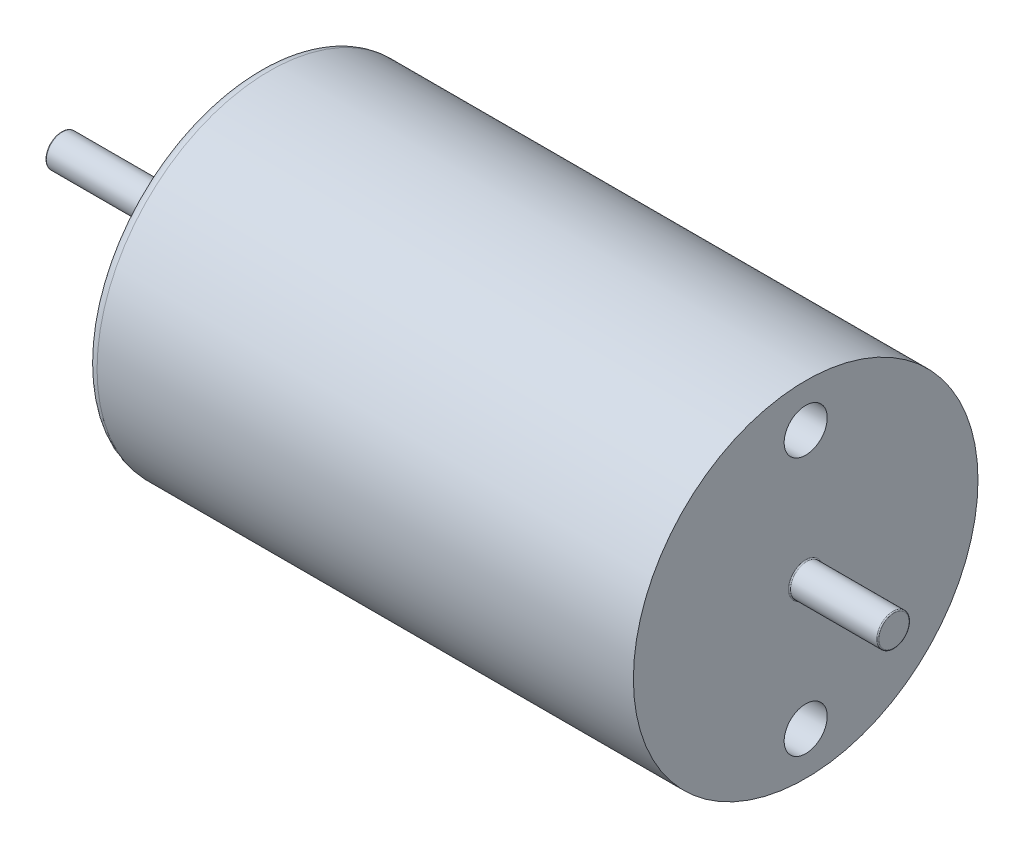
ISO-10303-21;
HEADER;
FILE_DESCRIPTION(('STEP AP214'),'2;1');
FILE_NAME('part.step','',(''),(''),'','','');
FILE_SCHEMA(('AUTOMOTIVE_DESIGN { 1 0 10303 214 1 1 1 1 }'));
ENDSEC;
DATA;
#1=APPLICATION_CONTEXT('core data for automotive mechanical design processes');
#2=APPLICATION_PROTOCOL_DEFINITION('international standard','automotive_design',2000,#1);
#3=PRODUCT_CONTEXT('',#1,'mechanical');
#4=PRODUCT('Part','Part','',(#3));
#5=PRODUCT_RELATED_PRODUCT_CATEGORY('part','',(#4));
#6=PRODUCT_DEFINITION_FORMATION('','',#4);
#7=PRODUCT_DEFINITION_CONTEXT('part definition',#1,'design');
#8=PRODUCT_DEFINITION('design','',#6,#7);
#9=PRODUCT_DEFINITION_SHAPE('','',#8);
#10=(LENGTH_UNIT() NAMED_UNIT(*) SI_UNIT(.MILLI.,.METRE.));
#11=(NAMED_UNIT(*) PLANE_ANGLE_UNIT() SI_UNIT($,.RADIAN.));
#12=(NAMED_UNIT(*) SI_UNIT($,.STERADIAN.) SOLID_ANGLE_UNIT());
#13=UNCERTAINTY_MEASURE_WITH_UNIT(LENGTH_MEASURE(1.E-05),#10,'distance_accuracy_value','');
#14=(GEOMETRIC_REPRESENTATION_CONTEXT(3) GLOBAL_UNCERTAINTY_ASSIGNED_CONTEXT((#13)) GLOBAL_UNIT_ASSIGNED_CONTEXT((#10,
#11,#12)) REPRESENTATION_CONTEXT('',''));
#15=CARTESIAN_POINT('',(0.,0.,0.));
#16=DIRECTION('',(0.,0.,1.));
#17=DIRECTION('',(1.,0.,0.));
#18=AXIS2_PLACEMENT_3D('',#15,#16,#17);
#19=CARTESIAN_POINT('',(0.,0.,-0.750000000000001));
#20=DIRECTION('',(1.,0.,0.));
#21=DIRECTION('',(0.,0.,-1.));
#22=AXIS2_PLACEMENT_3D('',#19,#20,#21);
#23=PLANE('',#22);
#24=CARTESIAN_POINT('',(0.,0.,0.));
#25=DIRECTION('',(1.,0.,0.));
#26=DIRECTION('',(0.,0.,-1.));
#27=AXIS2_PLACEMENT_3D('',#24,#25,#26);
#28=CIRCLE('',#27,0.7);
#29=CARTESIAN_POINT('',(0.,0.,-0.7));
#30=VERTEX_POINT('',#29);
#31=EDGE_CURVE('E68',#30,#30,#28,.T.);
#32=ORIENTED_EDGE('',*,*,#31,.T.);
#33=EDGE_LOOP('',(#32));
#34=FACE_BOUND('',#33,.T.);
#35=ADVANCED_FACE('F36',(#34),#23,.T.);
#36=CARTESIAN_POINT('',(-38.65,0.,0.));
#37=DIRECTION('',(-1.,0.,0.));
#38=DIRECTION('',(0.,0.,1.));
#39=AXIS2_PLACEMENT_3D('',#36,#37,#38);
#40=PLANE('',#39);
#41=CARTESIAN_POINT('',(-38.65,0.,0.));
#42=DIRECTION('',(-1.,0.,0.));
#43=DIRECTION('',(0.,0.,1.));
#44=AXIS2_PLACEMENT_3D('',#41,#42,#43);
#45=CIRCLE('',#44,0.7);
#46=CARTESIAN_POINT('',(-38.65,0.,0.700000000000004));
#47=VERTEX_POINT('',#46);
#48=EDGE_CURVE('E10',#47,#47,#45,.T.);
#49=ORIENTED_EDGE('',*,*,#48,.T.);
#50=EDGE_LOOP('',(#49));
#51=FACE_BOUND('',#50,.T.);
#52=ADVANCED_FACE('F202',(#51),#40,.T.);
#53=CARTESIAN_POINT('',(0.,0.,0.));
#54=DIRECTION('',(1.,0.,0.));
#55=DIRECTION('',(0.,0.,-1.));
#56=AXIS2_PLACEMENT_3D('',#53,#54,#55);
#57=CYLINDRICAL_SURFACE('',#56,0.75);
#58=CARTESIAN_POINT('',(-38.6,0.,0.));
#59=DIRECTION('',(-1.,0.,0.));
#60=DIRECTION('',(0.,0.,1.));
#61=AXIS2_PLACEMENT_3D('',#58,#59,#60);
#62=CIRCLE('',#61,0.75);
#63=CARTESIAN_POINT('',(-38.6,0.,0.750000000000004));
#64=VERTEX_POINT('',#63);
#65=EDGE_CURVE('E44',#64,#64,#62,.F.);
#66=ORIENTED_EDGE('',*,*,#65,.T.);
#67=EDGE_LOOP('',(#66));
#68=FACE_BOUND('',#67,.T.);
#69=CARTESIAN_POINT('',(-32.35,0.,0.));
#70=DIRECTION('',(-1.,0.,0.));
#71=DIRECTION('',(0.,0.,1.));
#72=AXIS2_PLACEMENT_3D('',#69,#70,#71);
#73=CIRCLE('',#72,0.75);
#74=CARTESIAN_POINT('',(-32.35,0.,0.750000000000004));
#75=VERTEX_POINT('',#74);
#76=EDGE_CURVE('E49',#75,#75,#73,.T.);
#77=ORIENTED_EDGE('',*,*,#76,.T.);
#78=EDGE_LOOP('',(#77));
#79=FACE_BOUND('',#78,.T.);
#80=ADVANCED_FACE('F208',(#68,#79),#57,.T.);
#81=CARTESIAN_POINT('',(-32.3,0.,-0.749999999999995));
#82=DIRECTION('',(-1.,0.,0.));
#83=DIRECTION('',(0.,0.,1.));
#84=AXIS2_PLACEMENT_3D('',#81,#82,#83);
#85=PLANE('',#84);
#86=CARTESIAN_POINT('',(-32.3,0.,0.));
#87=DIRECTION('',(-1.,0.,0.));
#88=DIRECTION('',(0.,0.,1.));
#89=AXIS2_PLACEMENT_3D('',#86,#87,#88);
#90=CIRCLE('',#89,2.45);
#91=CARTESIAN_POINT('',(-32.3,0.,2.45));
#92=VERTEX_POINT('',#91);
#93=EDGE_CURVE('E72',#92,#92,#90,.T.);
#94=ORIENTED_EDGE('',*,*,#93,.T.);
#95=EDGE_LOOP('',(#94));
#96=FACE_BOUND('',#95,.T.);
#97=CARTESIAN_POINT('',(-32.3,0.,0.));
#98=DIRECTION('',(-1.,0.,0.));
#99=DIRECTION('',(0.,0.,1.));
#100=AXIS2_PLACEMENT_3D('',#97,#98,#99);
#101=CIRCLE('',#100,0.8);
#102=CARTESIAN_POINT('',(-32.3,0.,0.800000000000003));
#103=VERTEX_POINT('',#102);
#104=EDGE_CURVE('E76',#103,#103,#101,.F.);
#105=ORIENTED_EDGE('',*,*,#104,.T.);
#106=EDGE_LOOP('',(#105));
#107=FACE_BOUND('',#106,.T.);
#108=ADVANCED_FACE('F250',(#96,#107),#85,.T.);
#109=CARTESIAN_POINT('',(0.,0.,0.));
#110=DIRECTION('',(1.,0.,0.));
#111=DIRECTION('',(0.,0.,-1.));
#112=AXIS2_PLACEMENT_3D('',#109,#110,#111);
#113=CYLINDRICAL_SURFACE('',#112,2.5);
#114=CARTESIAN_POINT('',(-29.55,0.,0.));
#115=DIRECTION('',(-1.,0.,0.));
#116=DIRECTION('',(0.,0.,1.));
#117=AXIS2_PLACEMENT_3D('',#114,#115,#116);
#118=CIRCLE('',#117,2.5);
#119=CARTESIAN_POINT('',(-29.55,0.,2.5));
#120=VERTEX_POINT('',#119);
#121=EDGE_CURVE('E80',#120,#120,#118,.T.);
#122=ORIENTED_EDGE('',*,*,#121,.T.);
#123=EDGE_LOOP('',(#122));
#124=FACE_BOUND('',#123,.T.);
#125=CARTESIAN_POINT('',(-32.25,0.,0.));
#126=DIRECTION('',(-1.,0.,0.));
#127=DIRECTION('',(0.,0.,1.));
#128=AXIS2_PLACEMENT_3D('',#125,#126,#127);
#129=CIRCLE('',#128,2.5);
#130=CARTESIAN_POINT('',(-32.25,0.,2.5));
#131=VERTEX_POINT('',#130);
#132=EDGE_CURVE('E84',#131,#131,#129,.F.);
#133=ORIENTED_EDGE('',*,*,#132,.T.);
#134=EDGE_LOOP('',(#133));
#135=FACE_BOUND('',#134,.T.);
#136=ADVANCED_FACE('F198',(#124,#135),#113,.T.);
#137=CARTESIAN_POINT('',(-29.5,0.,-2.5));
#138=DIRECTION('',(-1.,0.,0.));
#139=DIRECTION('',(0.,0.,1.));
#140=AXIS2_PLACEMENT_3D('',#137,#138,#139);
#141=PLANE('',#140);
#142=CARTESIAN_POINT('',(-29.5,0.,0.));
#143=DIRECTION('',(-1.,0.,0.));
#144=DIRECTION('',(0.,0.,1.));
#145=AXIS2_PLACEMENT_3D('',#142,#143,#144);
#146=CIRCLE('',#145,2.55);
#147=CARTESIAN_POINT('',(-29.5,0.,2.55));
#148=VERTEX_POINT('',#147);
#149=EDGE_CURVE('E88',#148,#148,#146,.F.);
#150=ORIENTED_EDGE('',*,*,#149,.T.);
#151=EDGE_LOOP('',(#150));
#152=FACE_BOUND('',#151,.T.);
#153=CARTESIAN_POINT('',(-29.5,0.,0.));
#154=DIRECTION('',(-1.,0.,0.));
#155=DIRECTION('',(0.,0.,1.));
#156=AXIS2_PLACEMENT_3D('',#153,#154,#155);
#157=CIRCLE('',#156,7.5);
#158=CARTESIAN_POINT('',(-29.5,0.,7.5));
#159=VERTEX_POINT('',#158);
#160=EDGE_CURVE('E92',#159,#159,#157,.T.);
#161=ORIENTED_EDGE('',*,*,#160,.T.);
#162=EDGE_LOOP('',(#161));
#163=FACE_BOUND('',#162,.T.);
#164=CARTESIAN_POINT('',(-29.5,2.50000000000005,-4.33012701892216));
#165=DIRECTION('',(-1.,0.,0.));
#166=DIRECTION('',(0.,0.866025403784433,0.50000000000001));
#167=AXIS2_PLACEMENT_3D('',#164,#165,#166);
#168=CIRCLE('',#167,1.);
#169=CARTESIAN_POINT('',(-29.5,3.36602540378448,-3.83012701892215));
#170=VERTEX_POINT('',#169);
#171=EDGE_CURVE('E121',#170,#170,#168,.T.);
#172=ORIENTED_EDGE('',*,*,#171,.F.);
#173=EDGE_LOOP('',(#172));
#174=FACE_BOUND('',#173,.T.);
#175=CARTESIAN_POINT('',(-29.5,-2.49999999999996,-4.33012701892221));
#176=DIRECTION('',(-1.,0.,0.));
#177=DIRECTION('',(0.,0.866025403784443,-0.499999999999992));
#178=AXIS2_PLACEMENT_3D('',#175,#176,#177);
#179=CIRCLE('',#178,1.);
#180=CARTESIAN_POINT('',(-29.5,-1.63397459621552,-4.83012701892221));
#181=VERTEX_POINT('',#180);
#182=EDGE_CURVE('E130',#181,#181,#179,.T.);
#183=ORIENTED_EDGE('',*,*,#182,.F.);
#184=EDGE_LOOP('',(#183));
#185=FACE_BOUND('',#184,.T.);
#186=CARTESIAN_POINT('',(-29.5,-5.,0.));
#187=DIRECTION('',(-1.,0.,0.));
#188=DIRECTION('',(0.,0.,-1.));
#189=AXIS2_PLACEMENT_3D('',#186,#187,#188);
#190=CIRCLE('',#189,1.);
#191=CARTESIAN_POINT('',(-29.5,-5.,-0.999999999999996));
#192=VERTEX_POINT('',#191);
#193=EDGE_CURVE('E138',#192,#192,#190,.T.);
#194=ORIENTED_EDGE('',*,*,#193,.F.);
#195=EDGE_LOOP('',(#194));
#196=FACE_BOUND('',#195,.T.);
#197=CARTESIAN_POINT('',(-29.5,-2.50000000000002,4.33012701892219));
#198=DIRECTION('',(-1.,0.,0.));
#199=DIRECTION('',(0.,-0.866025403784436,-0.500000000000004));
#200=AXIS2_PLACEMENT_3D('',#197,#198,#199);
#201=CIRCLE('',#200,1.);
#202=CARTESIAN_POINT('',(-29.5,-3.36602540378446,3.83012701892218));
#203=VERTEX_POINT('',#202);
#204=EDGE_CURVE('E146',#203,#203,#201,.T.);
#205=ORIENTED_EDGE('',*,*,#204,.F.);
#206=EDGE_LOOP('',(#205));
#207=FACE_BOUND('',#206,.T.);
#208=CARTESIAN_POINT('',(-29.5,2.49999999999999,4.3301270189222));
#209=DIRECTION('',(-1.,0.,0.));
#210=DIRECTION('',(0.,-0.86602540378444,0.499999999999998));
#211=AXIS2_PLACEMENT_3D('',#208,#209,#210);
#212=CIRCLE('',#211,1.);
#213=CARTESIAN_POINT('',(-29.5,1.63397459621555,4.8301270189222));
#214=VERTEX_POINT('',#213);
#215=EDGE_CURVE('E113',#214,#214,#212,.T.);
#216=ORIENTED_EDGE('',*,*,#215,.F.);
#217=EDGE_LOOP('',(#216));
#218=FACE_BOUND('',#217,.T.);
#219=CARTESIAN_POINT('',(-29.5,5.,0.));
#220=DIRECTION('',(-1.,0.,0.));
#221=DIRECTION('',(0.,0.,1.));
#222=AXIS2_PLACEMENT_3D('',#219,#220,#221);
#223=CIRCLE('',#222,1.);
#224=CARTESIAN_POINT('',(-29.5,5.,1.));
#225=VERTEX_POINT('',#224);
#226=EDGE_CURVE('E105',#225,#225,#223,.T.);
#227=ORIENTED_EDGE('',*,*,#226,.F.);
#228=EDGE_LOOP('',(#227));
#229=FACE_BOUND('',#228,.T.);
#230=ADVANCED_FACE('F191',(#152,#163,#174,#185,#196,#207,#218,#229),#141,.T.);
#231=CARTESIAN_POINT('',(0.,0.,0.));
#232=DIRECTION('',(1.,0.,0.));
#233=DIRECTION('',(0.,0.,-1.));
#234=AXIS2_PLACEMENT_3D('',#231,#232,#233);
#235=CYLINDRICAL_SURFACE('',#234,8.);
#236=CARTESIAN_POINT('',(-29.,0.,0.));
#237=DIRECTION('',(-1.,0.,0.));
#238=DIRECTION('',(0.,0.,1.));
#239=AXIS2_PLACEMENT_3D('',#236,#237,#238);
#240=CIRCLE('',#239,8.);
#241=CARTESIAN_POINT('',(-29.,0.,8.));
#242=VERTEX_POINT('',#241);
#243=EDGE_CURVE('E96',#242,#242,#240,.F.);
#244=ORIENTED_EDGE('',*,*,#243,.T.);
#245=EDGE_LOOP('',(#244));
#246=FACE_BOUND('',#245,.T.);
#247=CARTESIAN_POINT('',(-4.1,0.,0.));
#248=DIRECTION('',(1.,0.,0.));
#249=DIRECTION('',(0.,0.,-1.));
#250=AXIS2_PLACEMENT_3D('',#247,#248,#249);
#251=CIRCLE('',#250,8.);
#252=CARTESIAN_POINT('',(-4.1,0.,-8.));
#253=VERTEX_POINT('',#252);
#254=EDGE_CURVE('E100',#253,#253,#251,.T.);
#255=ORIENTED_EDGE('',*,*,#254,.F.);
#256=EDGE_LOOP('',(#255));
#257=FACE_BOUND('',#256,.T.);
#258=ADVANCED_FACE('F182',(#246,#257),#235,.T.);
#259=CARTESIAN_POINT('',(-4.1,0.,-8.));
#260=DIRECTION('',(1.,0.,0.));
#261=DIRECTION('',(0.,0.,-1.));
#262=AXIS2_PLACEMENT_3D('',#259,#260,#261);
#263=PLANE('',#262);
#264=CARTESIAN_POINT('',(-4.1,-6.,0.));
#265=DIRECTION('',(1.,0.,0.));
#266=DIRECTION('',(0.,0.,1.));
#267=AXIS2_PLACEMENT_3D('',#264,#265,#266);
#268=CIRCLE('',#267,1.);
#269=CARTESIAN_POINT('',(-4.1,-6.,1.));
#270=VERTEX_POINT('',#269);
#271=EDGE_CURVE('E161',#270,#270,#268,.T.);
#272=ORIENTED_EDGE('',*,*,#271,.F.);
#273=EDGE_LOOP('',(#272));
#274=FACE_BOUND('',#273,.T.);
#275=CARTESIAN_POINT('',(-4.1,6.,0.));
#276=DIRECTION('',(1.,0.,0.));
#277=DIRECTION('',(0.,0.,-1.));
#278=AXIS2_PLACEMENT_3D('',#275,#276,#277);
#279=CIRCLE('',#278,1.);
#280=CARTESIAN_POINT('',(-4.1,6.,-1.));
#281=VERTEX_POINT('',#280);
#282=EDGE_CURVE('E153',#281,#281,#279,.T.);
#283=ORIENTED_EDGE('',*,*,#282,.F.);
#284=EDGE_LOOP('',(#283));
#285=FACE_BOUND('',#284,.T.);
#286=CARTESIAN_POINT('',(-4.1,0.,0.));
#287=DIRECTION('',(1.,0.,0.));
#288=DIRECTION('',(0.,0.,-1.));
#289=AXIS2_PLACEMENT_3D('',#286,#287,#288);
#290=CIRCLE('',#289,0.8);
#291=CARTESIAN_POINT('',(-4.1,0.,-0.8));
#292=VERTEX_POINT('',#291);
#293=EDGE_CURVE('E54',#292,#292,#290,.F.);
#294=ORIENTED_EDGE('',*,*,#293,.T.);
#295=EDGE_LOOP('',(#294));
#296=FACE_BOUND('',#295,.T.);
#297=ORIENTED_EDGE('',*,*,#254,.T.);
#298=EDGE_LOOP('',(#297));
#299=FACE_BOUND('',#298,.T.);
#300=ADVANCED_FACE('F178',(#274,#285,#296,#299),#263,.T.);
#301=CARTESIAN_POINT('',(0.,0.,0.));
#302=DIRECTION('',(1.,0.,0.));
#303=DIRECTION('',(0.,0.,-1.));
#304=AXIS2_PLACEMENT_3D('',#301,#302,#303);
#305=CYLINDRICAL_SURFACE('',#304,0.75);
#306=CARTESIAN_POINT('',(-0.05,0.,0.));
#307=DIRECTION('',(1.,0.,0.));
#308=DIRECTION('',(0.,0.,-1.));
#309=AXIS2_PLACEMENT_3D('',#306,#307,#308);
#310=CIRCLE('',#309,0.75);
#311=CARTESIAN_POINT('',(-0.0500000000000001,0.,-0.75));
#312=VERTEX_POINT('',#311);
#313=EDGE_CURVE('E60',#312,#312,#310,.F.);
#314=ORIENTED_EDGE('',*,*,#313,.T.);
#315=EDGE_LOOP('',(#314));
#316=FACE_BOUND('',#315,.T.);
#317=CARTESIAN_POINT('',(-4.05,0.,0.));
#318=DIRECTION('',(1.,0.,0.));
#319=DIRECTION('',(0.,0.,-1.));
#320=AXIS2_PLACEMENT_3D('',#317,#318,#319);
#321=CIRCLE('',#320,0.75);
#322=CARTESIAN_POINT('',(-4.05,0.,-0.75));
#323=VERTEX_POINT('',#322);
#324=EDGE_CURVE('E64',#323,#323,#321,.T.);
#325=ORIENTED_EDGE('',*,*,#324,.T.);
#326=EDGE_LOOP('',(#325));
#327=FACE_BOUND('',#326,.T.);
#328=ADVANCED_FACE('F181',(#316,#327),#305,.T.);
#329=CARTESIAN_POINT('',(-26.5,5.,0.));
#330=DIRECTION('',(-1.,0.,0.));
#331=DIRECTION('',(0.,0.,1.));
#332=AXIS2_PLACEMENT_3D('',#329,#330,#331);
#333=CYLINDRICAL_SURFACE('',#332,1.);
#334=CARTESIAN_POINT('',(-26.5,5.,0.));
#335=DIRECTION('',(-1.,0.,0.));
#336=DIRECTION('',(0.,0.,1.));
#337=AXIS2_PLACEMENT_3D('',#334,#335,#336);
#338=CIRCLE('',#337,1.);
#339=CARTESIAN_POINT('',(-26.5,5.,1.));
#340=VERTEX_POINT('',#339);
#341=EDGE_CURVE('E104',#340,#340,#338,.T.);
#342=ORIENTED_EDGE('',*,*,#341,.F.);
#343=EDGE_LOOP('',(#342));
#344=FACE_BOUND('',#343,.T.);
#345=ORIENTED_EDGE('',*,*,#226,.T.);
#346=EDGE_LOOP('',(#345));
#347=FACE_BOUND('',#346,.T.);
#348=ADVANCED_FACE('F397',(#344,#347),#333,.F.);
#349=CARTESIAN_POINT('',(-26.5,5.,0.));
#350=DIRECTION('',(-1.,0.,0.));
#351=DIRECTION('',(0.,0.,1.));
#352=AXIS2_PLACEMENT_3D('',#349,#350,#351);
#353=PLANE('',#352);
#354=ORIENTED_EDGE('',*,*,#341,.T.);
#355=EDGE_LOOP('',(#354));
#356=FACE_BOUND('',#355,.T.);
#357=ADVANCED_FACE('F387',(#356),#353,.T.);
#358=CARTESIAN_POINT('',(-26.5,2.49999999999999,4.3301270189222));
#359=DIRECTION('',(-1.,0.,0.));
#360=DIRECTION('',(0.,0.,1.));
#361=AXIS2_PLACEMENT_3D('',#358,#359,#360);
#362=CYLINDRICAL_SURFACE('',#361,1.);
#363=CARTESIAN_POINT('',(-26.5,2.49999999999999,4.3301270189222));
#364=DIRECTION('',(-1.,0.,0.));
#365=DIRECTION('',(0.,-0.86602540378444,0.499999999999998));
#366=AXIS2_PLACEMENT_3D('',#363,#364,#365);
#367=CIRCLE('',#366,1.);
#368=CARTESIAN_POINT('',(-26.5,1.63397459621555,4.8301270189222));
#369=VERTEX_POINT('',#368);
#370=EDGE_CURVE('E109',#369,#369,#367,.T.);
#371=ORIENTED_EDGE('',*,*,#370,.F.);
#372=EDGE_LOOP('',(#371));
#373=FACE_BOUND('',#372,.T.);
#374=ORIENTED_EDGE('',*,*,#215,.T.);
#375=EDGE_LOOP('',(#374));
#376=FACE_BOUND('',#375,.T.);
#377=ADVANCED_FACE('F377',(#373,#376),#362,.F.);
#378=CARTESIAN_POINT('',(-26.5,2.49999999999999,4.3301270189222));
#379=DIRECTION('',(-1.,0.,0.));
#380=DIRECTION('',(0.,-0.86602540378444,0.499999999999998));
#381=AXIS2_PLACEMENT_3D('',#378,#379,#380);
#382=PLANE('',#381);
#383=ORIENTED_EDGE('',*,*,#370,.T.);
#384=EDGE_LOOP('',(#383));
#385=FACE_BOUND('',#384,.T.);
#386=ADVANCED_FACE('F367',(#385),#382,.T.);
#387=CARTESIAN_POINT('',(-26.5,-2.50000000000002,4.33012701892219));
#388=DIRECTION('',(-1.,0.,0.));
#389=DIRECTION('',(0.,0.,1.));
#390=AXIS2_PLACEMENT_3D('',#387,#388,#389);
#391=CYLINDRICAL_SURFACE('',#390,1.);
#392=CARTESIAN_POINT('',(-26.5,-2.50000000000002,4.33012701892219));
#393=DIRECTION('',(-1.,0.,0.));
#394=DIRECTION('',(0.,-0.866025403784436,-0.500000000000004));
#395=AXIS2_PLACEMENT_3D('',#392,#393,#394);
#396=CIRCLE('',#395,1.);
#397=CARTESIAN_POINT('',(-26.5,-3.36602540378446,3.83012701892218));
#398=VERTEX_POINT('',#397);
#399=EDGE_CURVE('E117',#398,#398,#396,.T.);
#400=ORIENTED_EDGE('',*,*,#399,.F.);
#401=EDGE_LOOP('',(#400));
#402=FACE_BOUND('',#401,.T.);
#403=ORIENTED_EDGE('',*,*,#204,.T.);
#404=EDGE_LOOP('',(#403));
#405=FACE_BOUND('',#404,.T.);
#406=ADVANCED_FACE('F357',(#402,#405),#391,.F.);
#407=CARTESIAN_POINT('',(-26.5,-2.50000000000002,4.33012701892219));
#408=DIRECTION('',(-1.,0.,0.));
#409=DIRECTION('',(0.,-0.866025403784436,-0.500000000000004));
#410=AXIS2_PLACEMENT_3D('',#407,#408,#409);
#411=PLANE('',#410);
#412=ORIENTED_EDGE('',*,*,#399,.T.);
#413=EDGE_LOOP('',(#412));
#414=FACE_BOUND('',#413,.T.);
#415=ADVANCED_FACE('F347',(#414),#411,.T.);
#416=CARTESIAN_POINT('',(-26.5,-5.,0.));
#417=DIRECTION('',(-1.,0.,0.));
#418=DIRECTION('',(0.,0.,1.));
#419=AXIS2_PLACEMENT_3D('',#416,#417,#418);
#420=CYLINDRICAL_SURFACE('',#419,1.);
#421=CARTESIAN_POINT('',(-26.5,-5.,0.));
#422=DIRECTION('',(-1.,0.,0.));
#423=DIRECTION('',(0.,0.,-1.));
#424=AXIS2_PLACEMENT_3D('',#421,#422,#423);
#425=CIRCLE('',#424,1.);
#426=CARTESIAN_POINT('',(-26.5,-5.,-0.999999999999997));
#427=VERTEX_POINT('',#426);
#428=EDGE_CURVE('E142',#427,#427,#425,.T.);
#429=ORIENTED_EDGE('',*,*,#428,.F.);
#430=EDGE_LOOP('',(#429));
#431=FACE_BOUND('',#430,.T.);
#432=ORIENTED_EDGE('',*,*,#193,.T.);
#433=EDGE_LOOP('',(#432));
#434=FACE_BOUND('',#433,.T.);
#435=ADVANCED_FACE('F337',(#431,#434),#420,.F.);
#436=CARTESIAN_POINT('',(-26.5,-5.,0.));
#437=DIRECTION('',(-1.,0.,0.));
#438=DIRECTION('',(0.,0.,-1.));
#439=AXIS2_PLACEMENT_3D('',#436,#437,#438);
#440=PLANE('',#439);
#441=ORIENTED_EDGE('',*,*,#428,.T.);
#442=EDGE_LOOP('',(#441));
#443=FACE_BOUND('',#442,.T.);
#444=ADVANCED_FACE('F327',(#443),#440,.T.);
#445=CARTESIAN_POINT('',(-26.5,-2.49999999999996,-4.33012701892221));
#446=DIRECTION('',(-1.,0.,0.));
#447=DIRECTION('',(0.,0.,1.));
#448=AXIS2_PLACEMENT_3D('',#445,#446,#447);
#449=CYLINDRICAL_SURFACE('',#448,1.);
#450=CARTESIAN_POINT('',(-26.5,-2.49999999999996,-4.33012701892221));
#451=DIRECTION('',(-1.,0.,0.));
#452=DIRECTION('',(0.,0.866025403784443,-0.499999999999992));
#453=AXIS2_PLACEMENT_3D('',#450,#451,#452);
#454=CIRCLE('',#453,1.);
#455=CARTESIAN_POINT('',(-26.5,-1.63397459621552,-4.83012701892221));
#456=VERTEX_POINT('',#455);
#457=EDGE_CURVE('E134',#456,#456,#454,.T.);
#458=ORIENTED_EDGE('',*,*,#457,.F.);
#459=EDGE_LOOP('',(#458));
#460=FACE_BOUND('',#459,.T.);
#461=ORIENTED_EDGE('',*,*,#182,.T.);
#462=EDGE_LOOP('',(#461));
#463=FACE_BOUND('',#462,.T.);
#464=ADVANCED_FACE('F317',(#460,#463),#449,.F.);
#465=CARTESIAN_POINT('',(-26.5,-2.49999999999996,-4.33012701892221));
#466=DIRECTION('',(-1.,0.,0.));
#467=DIRECTION('',(0.,0.866025403784443,-0.499999999999992));
#468=AXIS2_PLACEMENT_3D('',#465,#466,#467);
#469=PLANE('',#468);
#470=ORIENTED_EDGE('',*,*,#457,.T.);
#471=EDGE_LOOP('',(#470));
#472=FACE_BOUND('',#471,.T.);
#473=ADVANCED_FACE('F307',(#472),#469,.T.);
#474=CARTESIAN_POINT('',(-26.5,2.50000000000005,-4.33012701892216));
#475=DIRECTION('',(-1.,0.,0.));
#476=DIRECTION('',(0.,0.,1.));
#477=AXIS2_PLACEMENT_3D('',#474,#475,#476);
#478=CYLINDRICAL_SURFACE('',#477,1.);
#479=CARTESIAN_POINT('',(-26.5,2.50000000000005,-4.33012701892216));
#480=DIRECTION('',(-1.,0.,0.));
#481=DIRECTION('',(0.,0.866025403784433,0.50000000000001));
#482=AXIS2_PLACEMENT_3D('',#479,#480,#481);
#483=CIRCLE('',#482,1.);
#484=CARTESIAN_POINT('',(-26.5,3.36602540378448,-3.83012701892215));
#485=VERTEX_POINT('',#484);
#486=EDGE_CURVE('E125',#485,#485,#483,.T.);
#487=ORIENTED_EDGE('',*,*,#486,.F.);
#488=EDGE_LOOP('',(#487));
#489=FACE_BOUND('',#488,.T.);
#490=ORIENTED_EDGE('',*,*,#171,.T.);
#491=EDGE_LOOP('',(#490));
#492=FACE_BOUND('',#491,.T.);
#493=ADVANCED_FACE('F297',(#489,#492),#478,.F.);
#494=CARTESIAN_POINT('',(-26.5,2.50000000000005,-4.33012701892216));
#495=DIRECTION('',(-1.,0.,0.));
#496=DIRECTION('',(0.,0.866025403784433,0.50000000000001));
#497=AXIS2_PLACEMENT_3D('',#494,#495,#496);
#498=PLANE('',#497);
#499=ORIENTED_EDGE('',*,*,#486,.T.);
#500=EDGE_LOOP('',(#499));
#501=FACE_BOUND('',#500,.T.);
#502=ADVANCED_FACE('F216',(#501),#498,.T.);
#503=CARTESIAN_POINT('',(-29.,0.,0.));
#504=DIRECTION('',(-1.,0.,0.));
#505=DIRECTION('',(0.,0.,1.));
#506=AXIS2_PLACEMENT_3D('',#503,#504,#505);
#507=TOROIDAL_SURFACE('',#506,7.5,0.5);
#508=ORIENTED_EDGE('',*,*,#160,.F.);
#509=EDGE_LOOP('',(#508));
#510=FACE_BOUND('',#509,.T.);
#511=ORIENTED_EDGE('',*,*,#243,.F.);
#512=EDGE_LOOP('',(#511));
#513=FACE_BOUND('',#512,.T.);
#514=ADVANCED_FACE('F212',(#510,#513),#507,.T.);
#515=CARTESIAN_POINT('',(-29.55,0.,0.));
#516=DIRECTION('',(-1.,0.,0.));
#517=DIRECTION('',(0.,0.,1.));
#518=AXIS2_PLACEMENT_3D('',#515,#516,#517);
#519=TOROIDAL_SURFACE('',#518,2.55,0.05);
#520=ORIENTED_EDGE('',*,*,#121,.F.);
#521=EDGE_LOOP('',(#520));
#522=FACE_BOUND('',#521,.T.);
#523=ORIENTED_EDGE('',*,*,#149,.F.);
#524=EDGE_LOOP('',(#523));
#525=FACE_BOUND('',#524,.T.);
#526=ADVANCED_FACE('F215',(#522,#525),#519,.F.);
#527=CARTESIAN_POINT('',(-32.25,0.,0.));
#528=DIRECTION('',(-1.,0.,0.));
#529=DIRECTION('',(0.,0.,1.));
#530=AXIS2_PLACEMENT_3D('',#527,#528,#529);
#531=TOROIDAL_SURFACE('',#530,2.45,0.05);
#532=ORIENTED_EDGE('',*,*,#93,.F.);
#533=EDGE_LOOP('',(#532));
#534=FACE_BOUND('',#533,.T.);
#535=ORIENTED_EDGE('',*,*,#132,.F.);
#536=EDGE_LOOP('',(#535));
#537=FACE_BOUND('',#536,.T.);
#538=ADVANCED_FACE('F220',(#534,#537),#531,.T.);
#539=CARTESIAN_POINT('',(-0.05,0.,0.));
#540=DIRECTION('',(1.,0.,0.));
#541=DIRECTION('',(0.,0.,-1.));
#542=AXIS2_PLACEMENT_3D('',#539,#540,#541);
#543=TOROIDAL_SURFACE('',#542,0.7,0.05);
#544=ORIENTED_EDGE('',*,*,#313,.F.);
#545=EDGE_LOOP('',(#544));
#546=FACE_BOUND('',#545,.T.);
#547=ORIENTED_EDGE('',*,*,#31,.F.);
#548=EDGE_LOOP('',(#547));
#549=FACE_BOUND('',#548,.T.);
#550=ADVANCED_FACE('F224',(#546,#549),#543,.T.);
#551=CARTESIAN_POINT('',(-4.05,0.,0.));
#552=DIRECTION('',(1.,0.,0.));
#553=DIRECTION('',(0.,0.,-1.));
#554=AXIS2_PLACEMENT_3D('',#551,#552,#553);
#555=TOROIDAL_SURFACE('',#554,0.8,0.05);
#556=ORIENTED_EDGE('',*,*,#293,.F.);
#557=EDGE_LOOP('',(#556));
#558=FACE_BOUND('',#557,.T.);
#559=ORIENTED_EDGE('',*,*,#324,.F.);
#560=EDGE_LOOP('',(#559));
#561=FACE_BOUND('',#560,.T.);
#562=ADVANCED_FACE('F228',(#558,#561),#555,.F.);
#563=CARTESIAN_POINT('',(-38.6,0.,0.));
#564=DIRECTION('',(-1.,0.,0.));
#565=DIRECTION('',(0.,0.,1.));
#566=AXIS2_PLACEMENT_3D('',#563,#564,#565);
#567=TOROIDAL_SURFACE('',#566,0.7,0.05);
#568=ORIENTED_EDGE('',*,*,#48,.F.);
#569=EDGE_LOOP('',(#568));
#570=FACE_BOUND('',#569,.T.);
#571=ORIENTED_EDGE('',*,*,#65,.F.);
#572=EDGE_LOOP('',(#571));
#573=FACE_BOUND('',#572,.T.);
#574=ADVANCED_FACE('F231',(#570,#573),#567,.T.);
#575=CARTESIAN_POINT('',(-32.35,0.,0.));
#576=DIRECTION('',(-1.,0.,0.));
#577=DIRECTION('',(0.,0.,1.));
#578=AXIS2_PLACEMENT_3D('',#575,#576,#577);
#579=TOROIDAL_SURFACE('',#578,0.8,0.05);
#580=ORIENTED_EDGE('',*,*,#76,.F.);
#581=EDGE_LOOP('',(#580));
#582=FACE_BOUND('',#581,.T.);
#583=ORIENTED_EDGE('',*,*,#104,.F.);
#584=EDGE_LOOP('',(#583));
#585=FACE_BOUND('',#584,.T.);
#586=ADVANCED_FACE('F38',(#582,#585),#579,.F.);
#587=CARTESIAN_POINT('',(-7.1,6.,0.));
#588=DIRECTION('',(1.,0.,0.));
#589=DIRECTION('',(0.,0.,-1.));
#590=AXIS2_PLACEMENT_3D('',#587,#588,#589);
#591=CYLINDRICAL_SURFACE('',#590,1.);
#592=CARTESIAN_POINT('',(-7.1,6.,0.));
#593=DIRECTION('',(1.,0.,0.));
#594=DIRECTION('',(0.,0.,-1.));
#595=AXIS2_PLACEMENT_3D('',#592,#593,#594);
#596=CIRCLE('',#595,1.);
#597=CARTESIAN_POINT('',(-7.1,6.,-0.999999999999999));
#598=VERTEX_POINT('',#597);
#599=EDGE_CURVE('E126',#598,#598,#596,.T.);
#600=ORIENTED_EDGE('',*,*,#599,.F.);
#601=EDGE_LOOP('',(#600));
#602=FACE_BOUND('',#601,.T.);
#603=ORIENTED_EDGE('',*,*,#282,.T.);
#604=EDGE_LOOP('',(#603));
#605=FACE_BOUND('',#604,.T.);
#606=ADVANCED_FACE('F238',(#602,#605),#591,.F.);
#607=CARTESIAN_POINT('',(-7.1,6.,0.));
#608=DIRECTION('',(1.,0.,0.));
#609=DIRECTION('',(0.,0.,-1.));
#610=AXIS2_PLACEMENT_3D('',#607,#608,#609);
#611=PLANE('',#610);
#612=ORIENTED_EDGE('',*,*,#599,.T.);
#613=EDGE_LOOP('',(#612));
#614=FACE_BOUND('',#613,.T.);
#615=ADVANCED_FACE('F174',(#614),#611,.T.);
#616=CARTESIAN_POINT('',(-7.1,-6.,0.));
#617=DIRECTION('',(1.,0.,0.));
#618=DIRECTION('',(0.,0.,-1.));
#619=AXIS2_PLACEMENT_3D('',#616,#617,#618);
#620=CYLINDRICAL_SURFACE('',#619,1.);
#621=CARTESIAN_POINT('',(-7.1,-6.,0.));
#622=DIRECTION('',(1.,0.,0.));
#623=DIRECTION('',(0.,0.,1.));
#624=AXIS2_PLACEMENT_3D('',#621,#622,#623);
#625=CIRCLE('',#624,1.);
#626=CARTESIAN_POINT('',(-7.1,-6.,1.));
#627=VERTEX_POINT('',#626);
#628=EDGE_CURVE('E157',#627,#627,#625,.T.);
#629=ORIENTED_EDGE('',*,*,#628,.F.);
#630=EDGE_LOOP('',(#629));
#631=FACE_BOUND('',#630,.T.);
#632=ORIENTED_EDGE('',*,*,#271,.T.);
#633=EDGE_LOOP('',(#632));
#634=FACE_BOUND('',#633,.T.);
#635=ADVANCED_FACE('F171',(#631,#634),#620,.F.);
#636=CARTESIAN_POINT('',(-7.1,-6.,0.));
#637=DIRECTION('',(1.,0.,0.));
#638=DIRECTION('',(0.,0.,1.));
#639=AXIS2_PLACEMENT_3D('',#636,#637,#638);
#640=PLANE('',#639);
#641=ORIENTED_EDGE('',*,*,#628,.T.);
#642=EDGE_LOOP('',(#641));
#643=FACE_BOUND('',#642,.T.);
#644=ADVANCED_FACE('F169',(#643),#640,.T.);
#645=CLOSED_SHELL('',(#35,#52,#80,#108,#136,#230,#258,#300,#328,#348,#357,#377,#386,#406,#415,
#435,#444,#464,#473,#493,#502,#514,#526,#538,#550,#562,#574,#586,#606,#615,#635,#644));
#646=MANIFOLD_SOLID_BREP('B2',#645);
#647=ADVANCED_BREP_SHAPE_REPRESENTATION('',(#18,#646),#14);
#648=SHAPE_DEFINITION_REPRESENTATION(#9,#647);
ENDSEC;
END-ISO-10303-21;
